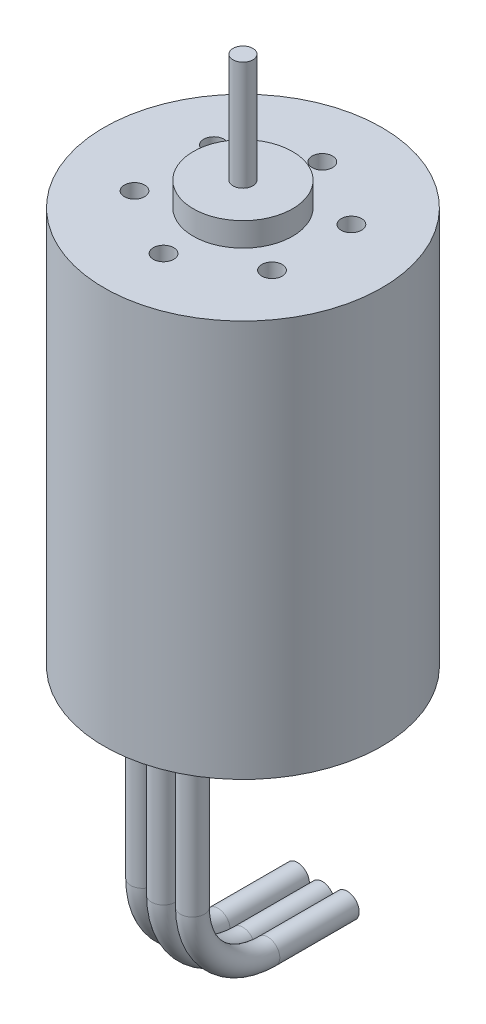
ISO-10303-21;
HEADER;
FILE_DESCRIPTION(('STEP AP214'),'2;1');
FILE_NAME('part.step','',(''),(''),'','','');
FILE_SCHEMA(('AUTOMOTIVE_DESIGN { 1 0 10303 214 1 1 1 1 }'));
ENDSEC;
DATA;
#1=APPLICATION_CONTEXT('core data for automotive mechanical design processes');
#2=APPLICATION_PROTOCOL_DEFINITION('international standard','automotive_design',2000,#1);
#3=PRODUCT_CONTEXT('',#1,'mechanical');
#4=PRODUCT('Part','Part','',(#3));
#5=PRODUCT_RELATED_PRODUCT_CATEGORY('part','',(#4));
#6=PRODUCT_DEFINITION_FORMATION('','',#4);
#7=PRODUCT_DEFINITION_CONTEXT('part definition',#1,'design');
#8=PRODUCT_DEFINITION('design','',#6,#7);
#9=PRODUCT_DEFINITION_SHAPE('','',#8);
#10=(LENGTH_UNIT() NAMED_UNIT(*) SI_UNIT(.MILLI.,.METRE.));
#11=(NAMED_UNIT(*) PLANE_ANGLE_UNIT() SI_UNIT($,.RADIAN.));
#12=(NAMED_UNIT(*) SI_UNIT($,.STERADIAN.) SOLID_ANGLE_UNIT());
#13=UNCERTAINTY_MEASURE_WITH_UNIT(LENGTH_MEASURE(1.E-05),#10,'distance_accuracy_value','');
#14=(GEOMETRIC_REPRESENTATION_CONTEXT(3) GLOBAL_UNCERTAINTY_ASSIGNED_CONTEXT((#13)) GLOBAL_UNIT_ASSIGNED_CONTEXT((#10,
#11,#12)) REPRESENTATION_CONTEXT('',''));
#15=CARTESIAN_POINT('',(0.,0.,0.));
#16=DIRECTION('',(0.,0.,1.));
#17=DIRECTION('',(1.,0.,0.));
#18=AXIS2_PLACEMENT_3D('',#15,#16,#17);
#19=CARTESIAN_POINT('',(0.,55.8,0.));
#20=DIRECTION('',(0.,1.,0.));
#21=DIRECTION('',(0.,0.,1.));
#22=AXIS2_PLACEMENT_3D('',#19,#20,#21);
#23=PLANE('',#22);
#24=CARTESIAN_POINT('',(0.,55.8,0.));
#25=DIRECTION('',(0.,-1.,0.));
#26=DIRECTION('',(0.,0.,-1.));
#27=AXIS2_PLACEMENT_3D('',#24,#25,#26);
#28=CIRCLE('',#27,1.);
#29=CARTESIAN_POINT('',(0.,55.8,-1.));
#30=VERTEX_POINT('',#29);
#31=EDGE_CURVE('E40',#30,#30,#28,.T.);
#32=ORIENTED_EDGE('',*,*,#31,.F.);
#33=EDGE_LOOP('',(#32));
#34=FACE_BOUND('',#33,.T.);
#35=ADVANCED_FACE('F37',(#34),#23,.T.);
#36=CARTESIAN_POINT('',(0.,0.,0.));
#37=DIRECTION('',(0.,-1.,0.));
#38=DIRECTION('',(0.,0.,-1.));
#39=AXIS2_PLACEMENT_3D('',#36,#37,#38);
#40=CYLINDRICAL_SURFACE('',#39,1.);
#41=ORIENTED_EDGE('',*,*,#31,.T.);
#42=EDGE_LOOP('',(#41));
#43=FACE_BOUND('',#42,.T.);
#44=CARTESIAN_POINT('',(0.,44.8,0.));
#45=DIRECTION('',(0.,-1.,0.));
#46=DIRECTION('',(0.,0.,-1.));
#47=AXIS2_PLACEMENT_3D('',#44,#45,#46);
#48=CIRCLE('',#47,1.);
#49=CARTESIAN_POINT('',(0.,44.8,-1.));
#50=VERTEX_POINT('',#49);
#51=EDGE_CURVE('E129',#50,#50,#48,.T.);
#52=ORIENTED_EDGE('',*,*,#51,.F.);
#53=EDGE_LOOP('',(#52));
#54=FACE_BOUND('',#53,.T.);
#55=ADVANCED_FACE('F168',(#43,#54),#40,.T.);
#56=CARTESIAN_POINT('',(1.,44.8,0.));
#57=DIRECTION('',(0.,1.,0.));
#58=DIRECTION('',(0.,0.,1.));
#59=AXIS2_PLACEMENT_3D('',#56,#57,#58);
#60=PLANE('',#59);
#61=ORIENTED_EDGE('',*,*,#51,.T.);
#62=EDGE_LOOP('',(#61));
#63=FACE_BOUND('',#62,.T.);
#64=CARTESIAN_POINT('',(0.,44.8,0.));
#65=DIRECTION('',(0.,-1.,0.));
#66=DIRECTION('',(0.,0.,-1.));
#67=AXIS2_PLACEMENT_3D('',#64,#65,#66);
#68=CIRCLE('',#67,4.99999999999999);
#69=CARTESIAN_POINT('',(0.,44.8,-4.99999999999999));
#70=VERTEX_POINT('',#69);
#71=EDGE_CURVE('E127',#70,#70,#68,.T.);
#72=ORIENTED_EDGE('',*,*,#71,.F.);
#73=EDGE_LOOP('',(#72));
#74=FACE_BOUND('',#73,.T.);
#75=ADVANCED_FACE('F173',(#63,#74),#60,.T.);
#76=CARTESIAN_POINT('',(0.,0.,0.));
#77=DIRECTION('',(0.,-1.,0.));
#78=DIRECTION('',(0.,0.,-1.));
#79=AXIS2_PLACEMENT_3D('',#76,#77,#78);
#80=CYLINDRICAL_SURFACE('',#79,4.99999999999999);
#81=ORIENTED_EDGE('',*,*,#71,.T.);
#82=EDGE_LOOP('',(#81));
#83=FACE_BOUND('',#82,.T.);
#84=CARTESIAN_POINT('',(0.,42.4,0.));
#85=DIRECTION('',(0.,-1.,0.));
#86=DIRECTION('',(0.,0.,-1.));
#87=AXIS2_PLACEMENT_3D('',#84,#85,#86);
#88=CIRCLE('',#87,4.99999999999999);
#89=CARTESIAN_POINT('',(0.,42.4,-4.99999999999999));
#90=VERTEX_POINT('',#89);
#91=EDGE_CURVE('E124',#90,#90,#88,.T.);
#92=ORIENTED_EDGE('',*,*,#91,.F.);
#93=EDGE_LOOP('',(#92));
#94=FACE_BOUND('',#93,.T.);
#95=ADVANCED_FACE('F177',(#83,#94),#80,.T.);
#96=CARTESIAN_POINT('',(4.99999999999999,42.4,0.));
#97=DIRECTION('',(0.,1.,0.));
#98=DIRECTION('',(0.,0.,1.));
#99=AXIS2_PLACEMENT_3D('',#96,#97,#98);
#100=PLANE('',#99);
#101=CARTESIAN_POINT('',(-6.92820323027546,42.4,-4.00000000000008));
#102=DIRECTION('',(0.,1.,0.));
#103=DIRECTION('',(0.,0.,1.));
#104=AXIS2_PLACEMENT_3D('',#101,#102,#103);
#105=CIRCLE('',#104,1.025);
#106=CARTESIAN_POINT('',(-6.92820323027546,42.4,-2.97500000000008));
#107=VERTEX_POINT('',#106);
#108=EDGE_CURVE('E76',#107,#107,#105,.T.);
#109=ORIENTED_EDGE('',*,*,#108,.F.);
#110=EDGE_LOOP('',(#109));
#111=FACE_BOUND('',#110,.T.);
#112=CARTESIAN_POINT('',(-6.92820323027555,42.4,3.99999999999994));
#113=DIRECTION('',(0.,1.,0.));
#114=DIRECTION('',(0.,0.,1.));
#115=AXIS2_PLACEMENT_3D('',#112,#113,#114);
#116=CIRCLE('',#115,1.025);
#117=CARTESIAN_POINT('',(-6.92820323027555,42.4,5.02499999999994));
#118=VERTEX_POINT('',#117);
#119=EDGE_CURVE('E75',#118,#118,#116,.T.);
#120=ORIENTED_EDGE('',*,*,#119,.F.);
#121=EDGE_LOOP('',(#120));
#122=FACE_BOUND('',#121,.T.);
#123=CARTESIAN_POINT('',(0.,42.4,8.));
#124=DIRECTION('',(0.,1.,0.));
#125=DIRECTION('',(0.,0.,1.));
#126=AXIS2_PLACEMENT_3D('',#123,#124,#125);
#127=CIRCLE('',#126,1.025);
#128=CARTESIAN_POINT('',(0.,42.4,9.025));
#129=VERTEX_POINT('',#128);
#130=EDGE_CURVE('E88',#129,#129,#127,.T.);
#131=ORIENTED_EDGE('',*,*,#130,.F.);
#132=EDGE_LOOP('',(#131));
#133=FACE_BOUND('',#132,.T.);
#134=CARTESIAN_POINT('',(6.92820323027549,42.4,4.00000000000003));
#135=DIRECTION('',(0.,1.,0.));
#136=DIRECTION('',(0.,0.,1.));
#137=AXIS2_PLACEMENT_3D('',#134,#135,#136);
#138=CIRCLE('',#137,1.025);
#139=CARTESIAN_POINT('',(6.92820323027549,42.4,5.02500000000003));
#140=VERTEX_POINT('',#139);
#141=EDGE_CURVE('E94',#140,#140,#138,.T.);
#142=ORIENTED_EDGE('',*,*,#141,.F.);
#143=EDGE_LOOP('',(#142));
#144=FACE_BOUND('',#143,.T.);
#145=CARTESIAN_POINT('',(6.92820323027552,42.4,-3.99999999999998));
#146=DIRECTION('',(0.,1.,0.));
#147=DIRECTION('',(0.,0.,1.));
#148=AXIS2_PLACEMENT_3D('',#145,#146,#147);
#149=CIRCLE('',#148,1.025);
#150=CARTESIAN_POINT('',(6.92820323027552,42.4,-2.97499999999999));
#151=VERTEX_POINT('',#150);
#152=EDGE_CURVE('E100',#151,#151,#149,.T.);
#153=ORIENTED_EDGE('',*,*,#152,.F.);
#154=EDGE_LOOP('',(#153));
#155=FACE_BOUND('',#154,.T.);
#156=CARTESIAN_POINT('',(0.,42.4,-8.));
#157=DIRECTION('',(0.,1.,0.));
#158=DIRECTION('',(0.,0.,1.));
#159=AXIS2_PLACEMENT_3D('',#156,#157,#158);
#160=CIRCLE('',#159,1.025);
#161=CARTESIAN_POINT('',(0.,42.4,-6.975));
#162=VERTEX_POINT('',#161);
#163=EDGE_CURVE('E106',#162,#162,#160,.T.);
#164=ORIENTED_EDGE('',*,*,#163,.F.);
#165=EDGE_LOOP('',(#164));
#166=FACE_BOUND('',#165,.T.);
#167=ORIENTED_EDGE('',*,*,#91,.T.);
#168=EDGE_LOOP('',(#167));
#169=FACE_BOUND('',#168,.T.);
#170=CARTESIAN_POINT('',(0.,42.4,0.));
#171=DIRECTION('',(0.,-1.,0.));
#172=DIRECTION('',(0.,0.,-1.));
#173=AXIS2_PLACEMENT_3D('',#170,#171,#172);
#174=CIRCLE('',#173,14.);
#175=CARTESIAN_POINT('',(0.,42.4,-14.));
#176=VERTEX_POINT('',#175);
#177=EDGE_CURVE('E121',#176,#176,#174,.T.);
#178=ORIENTED_EDGE('',*,*,#177,.F.);
#179=EDGE_LOOP('',(#178));
#180=FACE_BOUND('',#179,.T.);
#181=ADVANCED_FACE('F183',(#111,#122,#133,#144,#155,#166,#169,#180),#100,.T.);
#182=CARTESIAN_POINT('',(0.,0.,0.));
#183=DIRECTION('',(0.,-1.,0.));
#184=DIRECTION('',(0.,0.,-1.));
#185=AXIS2_PLACEMENT_3D('',#182,#183,#184);
#186=CYLINDRICAL_SURFACE('',#185,14.);
#187=ORIENTED_EDGE('',*,*,#177,.T.);
#188=EDGE_LOOP('',(#187));
#189=FACE_BOUND('',#188,.T.);
#190=CARTESIAN_POINT('',(0.,2.4,0.));
#191=DIRECTION('',(0.,-1.,0.));
#192=DIRECTION('',(0.,0.,-1.));
#193=AXIS2_PLACEMENT_3D('',#190,#191,#192);
#194=CIRCLE('',#193,14.);
#195=CARTESIAN_POINT('',(0.,2.4,-14.));
#196=VERTEX_POINT('',#195);
#197=EDGE_CURVE('E118',#196,#196,#194,.T.);
#198=ORIENTED_EDGE('',*,*,#197,.F.);
#199=EDGE_LOOP('',(#198));
#200=FACE_BOUND('',#199,.T.);
#201=ADVANCED_FACE('F187',(#189,#200),#186,.T.);
#202=CARTESIAN_POINT('',(5.,2.4,0.));
#203=DIRECTION('',(0.,-1.,0.));
#204=DIRECTION('',(0.,0.,-1.));
#205=AXIS2_PLACEMENT_3D('',#202,#203,#204);
#206=PLANE('',#205);
#207=CARTESIAN_POINT('',(-2.50778978372889,2.4,7.596775));
#208=DIRECTION('',(0.,-1.,0.));
#209=DIRECTION('',(0.,0.,-1.));
#210=AXIS2_PLACEMENT_3D('',#207,#208,#209);
#211=CIRCLE('',#210,1.2065);
#212=CARTESIAN_POINT('',(-2.50778978372889,2.4,6.390275));
#213=VERTEX_POINT('',#212);
#214=EDGE_CURVE('E11',#213,#213,#211,.T.);
#215=ORIENTED_EDGE('',*,*,#214,.F.);
#216=EDGE_LOOP('',(#215));
#217=FACE_BOUND('',#216,.T.);
#218=CARTESIAN_POINT('',(0.,2.4,8.));
#219=DIRECTION('',(0.,-1.,0.));
#220=DIRECTION('',(0.,0.,-1.));
#221=AXIS2_PLACEMENT_3D('',#218,#219,#220);
#222=CIRCLE('',#221,1.2065);
#223=CARTESIAN_POINT('',(0.,2.4,6.7935));
#224=VERTEX_POINT('',#223);
#225=EDGE_CURVE('E45',#224,#224,#222,.T.);
#226=ORIENTED_EDGE('',*,*,#225,.F.);
#227=EDGE_LOOP('',(#226));
#228=FACE_BOUND('',#227,.T.);
#229=CARTESIAN_POINT('',(2.50778978372889,2.4,7.596775));
#230=DIRECTION('',(0.,-1.,0.));
#231=DIRECTION('',(0.,0.,-1.));
#232=AXIS2_PLACEMENT_3D('',#229,#230,#231);
#233=CIRCLE('',#232,1.2065);
#234=CARTESIAN_POINT('',(2.50778978372889,2.4,6.390275));
#235=VERTEX_POINT('',#234);
#236=EDGE_CURVE('E134',#235,#235,#233,.T.);
#237=ORIENTED_EDGE('',*,*,#236,.F.);
#238=EDGE_LOOP('',(#237));
#239=FACE_BOUND('',#238,.T.);
#240=ORIENTED_EDGE('',*,*,#197,.T.);
#241=EDGE_LOOP('',(#240));
#242=FACE_BOUND('',#241,.T.);
#243=CARTESIAN_POINT('',(0.,2.4,0.));
#244=DIRECTION('',(0.,-1.,0.));
#245=DIRECTION('',(0.,0.,-1.));
#246=AXIS2_PLACEMENT_3D('',#243,#244,#245);
#247=CIRCLE('',#246,5.);
#248=CARTESIAN_POINT('',(0.,2.4,-5.));
#249=VERTEX_POINT('',#248);
#250=EDGE_CURVE('E115',#249,#249,#247,.T.);
#251=ORIENTED_EDGE('',*,*,#250,.F.);
#252=EDGE_LOOP('',(#251));
#253=FACE_BOUND('',#252,.T.);
#254=ADVANCED_FACE('F191',(#217,#228,#239,#242,#253),#206,.T.);
#255=CARTESIAN_POINT('',(0.,0.,0.));
#256=DIRECTION('',(0.,-1.,0.));
#257=DIRECTION('',(0.,0.,-1.));
#258=AXIS2_PLACEMENT_3D('',#255,#256,#257);
#259=CYLINDRICAL_SURFACE('',#258,5.);
#260=ORIENTED_EDGE('',*,*,#250,.T.);
#261=EDGE_LOOP('',(#260));
#262=FACE_BOUND('',#261,.T.);
#263=CARTESIAN_POINT('',(0.,0.,0.));
#264=DIRECTION('',(0.,-1.,0.));
#265=DIRECTION('',(0.,0.,-1.));
#266=AXIS2_PLACEMENT_3D('',#263,#264,#265);
#267=CIRCLE('',#266,5.);
#268=CARTESIAN_POINT('',(0.,0.,-5.));
#269=VERTEX_POINT('',#268);
#270=EDGE_CURVE('E112',#269,#269,#267,.T.);
#271=ORIENTED_EDGE('',*,*,#270,.F.);
#272=EDGE_LOOP('',(#271));
#273=FACE_BOUND('',#272,.T.);
#274=ADVANCED_FACE('F195',(#262,#273),#259,.T.);
#275=CARTESIAN_POINT('',(0.,0.,0.));
#276=DIRECTION('',(0.,-1.,0.));
#277=DIRECTION('',(0.,0.,-1.));
#278=AXIS2_PLACEMENT_3D('',#275,#276,#277);
#279=PLANE('',#278);
#280=ORIENTED_EDGE('',*,*,#270,.T.);
#281=EDGE_LOOP('',(#280));
#282=FACE_BOUND('',#281,.T.);
#283=ADVANCED_FACE('F199',(#282),#279,.T.);
#284=CARTESIAN_POINT('',(0.,38.400008,-8.));
#285=DIRECTION('',(0.,1.,0.));
#286=DIRECTION('',(0.,0.,1.));
#287=AXIS2_PLACEMENT_3D('',#284,#285,#286);
#288=CONICAL_SURFACE('',#287,1.025,1.02974425867665);
#289=CARTESIAN_POINT('',(0.,37.7841258654968,-8.));
#290=VERTEX_POINT('',#289);
#291=VERTEX_LOOP('',#290);
#292=FACE_BOUND('',#291,.T.);
#293=CARTESIAN_POINT('',(0.,38.400008,-8.));
#294=DIRECTION('',(0.,1.,0.));
#295=DIRECTION('',(0.,0.,1.));
#296=AXIS2_PLACEMENT_3D('',#293,#294,#295);
#297=CIRCLE('',#296,1.025);
#298=CARTESIAN_POINT('',(0.,38.400008,-6.975));
#299=VERTEX_POINT('',#298);
#300=EDGE_CURVE('E109',#299,#299,#297,.T.);
#301=ORIENTED_EDGE('',*,*,#300,.T.);
#302=EDGE_LOOP('',(#301));
#303=FACE_BOUND('',#302,.T.);
#304=ADVANCED_FACE('F203',(#292,#303),#288,.F.);
#305=CARTESIAN_POINT('',(0.,42.4,-8.));
#306=DIRECTION('',(0.,1.,0.));
#307=DIRECTION('',(0.,0.,1.));
#308=AXIS2_PLACEMENT_3D('',#305,#306,#307);
#309=CYLINDRICAL_SURFACE('',#308,1.025);
#310=ORIENTED_EDGE('',*,*,#300,.F.);
#311=EDGE_LOOP('',(#310));
#312=FACE_BOUND('',#311,.T.);
#313=ORIENTED_EDGE('',*,*,#163,.T.);
#314=EDGE_LOOP('',(#313));
#315=FACE_BOUND('',#314,.T.);
#316=ADVANCED_FACE('F207',(#312,#315),#309,.F.);
#317=CARTESIAN_POINT('',(6.92820323027552,38.400008,-3.99999999999998));
#318=DIRECTION('',(0.,1.,0.));
#319=DIRECTION('',(0.,0.,1.));
#320=AXIS2_PLACEMENT_3D('',#317,#318,#319);
#321=CONICAL_SURFACE('',#320,1.025,1.02974425867666);
#322=CARTESIAN_POINT('',(6.92820323027552,37.7841258654968,-3.99999999999998));
#323=VERTEX_POINT('',#322);
#324=VERTEX_LOOP('',#323);
#325=FACE_BOUND('',#324,.T.);
#326=CARTESIAN_POINT('',(6.92820323027552,38.400008,-3.99999999999998));
#327=DIRECTION('',(0.,1.,0.));
#328=DIRECTION('',(0.,0.,1.));
#329=AXIS2_PLACEMENT_3D('',#326,#327,#328);
#330=CIRCLE('',#329,1.025);
#331=CARTESIAN_POINT('',(6.92820323027552,38.400008,-2.97499999999999));
#332=VERTEX_POINT('',#331);
#333=EDGE_CURVE('E103',#332,#332,#330,.T.);
#334=ORIENTED_EDGE('',*,*,#333,.T.);
#335=EDGE_LOOP('',(#334));
#336=FACE_BOUND('',#335,.T.);
#337=ADVANCED_FACE('F210',(#325,#336),#321,.F.);
#338=CARTESIAN_POINT('',(6.92820323027552,42.4,-3.99999999999998));
#339=DIRECTION('',(0.,1.,0.));
#340=DIRECTION('',(0.,0.,1.));
#341=AXIS2_PLACEMENT_3D('',#338,#339,#340);
#342=CYLINDRICAL_SURFACE('',#341,1.025);
#343=ORIENTED_EDGE('',*,*,#333,.F.);
#344=EDGE_LOOP('',(#343));
#345=FACE_BOUND('',#344,.T.);
#346=ORIENTED_EDGE('',*,*,#152,.T.);
#347=EDGE_LOOP('',(#346));
#348=FACE_BOUND('',#347,.T.);
#349=ADVANCED_FACE('F214',(#345,#348),#342,.F.);
#350=CARTESIAN_POINT('',(6.92820323027549,38.400008,4.00000000000003));
#351=DIRECTION('',(0.,1.,0.));
#352=DIRECTION('',(0.,0.,1.));
#353=AXIS2_PLACEMENT_3D('',#350,#351,#352);
#354=CONICAL_SURFACE('',#353,1.025,1.02974425867665);
#355=CARTESIAN_POINT('',(6.92820323027549,37.7841258654968,4.00000000000003));
#356=VERTEX_POINT('',#355);
#357=VERTEX_LOOP('',#356);
#358=FACE_BOUND('',#357,.T.);
#359=CARTESIAN_POINT('',(6.92820323027549,38.400008,4.00000000000003));
#360=DIRECTION('',(0.,1.,0.));
#361=DIRECTION('',(0.,0.,1.));
#362=AXIS2_PLACEMENT_3D('',#359,#360,#361);
#363=CIRCLE('',#362,1.025);
#364=CARTESIAN_POINT('',(6.92820323027549,38.400008,5.02500000000003));
#365=VERTEX_POINT('',#364);
#366=EDGE_CURVE('E97',#365,#365,#363,.T.);
#367=ORIENTED_EDGE('',*,*,#366,.T.);
#368=EDGE_LOOP('',(#367));
#369=FACE_BOUND('',#368,.T.);
#370=ADVANCED_FACE('F217',(#358,#369),#354,.F.);
#371=CARTESIAN_POINT('',(6.92820323027549,42.4,4.00000000000003));
#372=DIRECTION('',(0.,1.,0.));
#373=DIRECTION('',(0.,0.,1.));
#374=AXIS2_PLACEMENT_3D('',#371,#372,#373);
#375=CYLINDRICAL_SURFACE('',#374,1.025);
#376=ORIENTED_EDGE('',*,*,#366,.F.);
#377=EDGE_LOOP('',(#376));
#378=FACE_BOUND('',#377,.T.);
#379=ORIENTED_EDGE('',*,*,#141,.T.);
#380=EDGE_LOOP('',(#379));
#381=FACE_BOUND('',#380,.T.);
#382=ADVANCED_FACE('F221',(#378,#381),#375,.F.);
#383=CARTESIAN_POINT('',(0.,38.400008,8.));
#384=DIRECTION('',(0.,1.,0.));
#385=DIRECTION('',(0.,0.,1.));
#386=AXIS2_PLACEMENT_3D('',#383,#384,#385);
#387=CONICAL_SURFACE('',#386,1.025,1.02974425867665);
#388=CARTESIAN_POINT('',(0.,37.7841258654968,8.));
#389=VERTEX_POINT('',#388);
#390=VERTEX_LOOP('',#389);
#391=FACE_BOUND('',#390,.T.);
#392=CARTESIAN_POINT('',(0.,38.400008,8.));
#393=DIRECTION('',(0.,1.,0.));
#394=DIRECTION('',(0.,0.,1.));
#395=AXIS2_PLACEMENT_3D('',#392,#393,#394);
#396=CIRCLE('',#395,1.025);
#397=CARTESIAN_POINT('',(0.,38.400008,9.025));
#398=VERTEX_POINT('',#397);
#399=EDGE_CURVE('E91',#398,#398,#396,.T.);
#400=ORIENTED_EDGE('',*,*,#399,.T.);
#401=EDGE_LOOP('',(#400));
#402=FACE_BOUND('',#401,.T.);
#403=ADVANCED_FACE('F225',(#391,#402),#387,.F.);
#404=CARTESIAN_POINT('',(0.,42.4,8.));
#405=DIRECTION('',(0.,1.,0.));
#406=DIRECTION('',(0.,0.,1.));
#407=AXIS2_PLACEMENT_3D('',#404,#405,#406);
#408=CYLINDRICAL_SURFACE('',#407,1.025);
#409=ORIENTED_EDGE('',*,*,#399,.F.);
#410=EDGE_LOOP('',(#409));
#411=FACE_BOUND('',#410,.T.);
#412=ORIENTED_EDGE('',*,*,#130,.T.);
#413=EDGE_LOOP('',(#412));
#414=FACE_BOUND('',#413,.T.);
#415=ADVANCED_FACE('F229',(#411,#414),#408,.F.);
#416=CARTESIAN_POINT('',(-6.92820323027555,38.400008,3.99999999999994));
#417=DIRECTION('',(0.,1.,0.));
#418=DIRECTION('',(0.,0.,1.));
#419=AXIS2_PLACEMENT_3D('',#416,#417,#418);
#420=CONICAL_SURFACE('',#419,1.025,1.02974425867665);
#421=CARTESIAN_POINT('',(-6.92820323027555,37.7841258654968,3.99999999999994));
#422=VERTEX_POINT('',#421);
#423=VERTEX_LOOP('',#422);
#424=FACE_BOUND('',#423,.T.);
#425=CARTESIAN_POINT('',(-6.92820323027555,38.400008,3.99999999999994));
#426=DIRECTION('',(0.,1.,0.));
#427=DIRECTION('',(0.,0.,1.));
#428=AXIS2_PLACEMENT_3D('',#425,#426,#427);
#429=CIRCLE('',#428,1.025);
#430=CARTESIAN_POINT('',(-6.92820323027555,38.400008,5.02499999999993));
#431=VERTEX_POINT('',#430);
#432=EDGE_CURVE('E79',#431,#431,#429,.T.);
#433=ORIENTED_EDGE('',*,*,#432,.T.);
#434=EDGE_LOOP('',(#433));
#435=FACE_BOUND('',#434,.T.);
#436=ADVANCED_FACE('F233',(#424,#435),#420,.F.);
#437=CARTESIAN_POINT('',(-6.92820323027555,42.4,3.99999999999994));
#438=DIRECTION('',(0.,1.,0.));
#439=DIRECTION('',(0.,0.,1.));
#440=AXIS2_PLACEMENT_3D('',#437,#438,#439);
#441=CYLINDRICAL_SURFACE('',#440,1.025);
#442=ORIENTED_EDGE('',*,*,#432,.F.);
#443=EDGE_LOOP('',(#442));
#444=FACE_BOUND('',#443,.T.);
#445=ORIENTED_EDGE('',*,*,#119,.T.);
#446=EDGE_LOOP('',(#445));
#447=FACE_BOUND('',#446,.T.);
#448=ADVANCED_FACE('F69',(#444,#447),#441,.F.);
#449=CARTESIAN_POINT('',(-6.92820323027546,38.400008,-4.00000000000008));
#450=DIRECTION('',(0.,1.,0.));
#451=DIRECTION('',(0.,0.,1.));
#452=AXIS2_PLACEMENT_3D('',#449,#450,#451);
#453=CONICAL_SURFACE('',#452,1.025,1.02974425867665);
#454=CARTESIAN_POINT('',(-6.92820323027546,37.7841258654968,-4.00000000000008));
#455=VERTEX_POINT('',#454);
#456=VERTEX_LOOP('',#455);
#457=FACE_BOUND('',#456,.T.);
#458=CARTESIAN_POINT('',(-6.92820323027546,38.400008,-4.00000000000008));
#459=DIRECTION('',(0.,1.,0.));
#460=DIRECTION('',(0.,0.,1.));
#461=AXIS2_PLACEMENT_3D('',#458,#459,#460);
#462=CIRCLE('',#461,1.025);
#463=CARTESIAN_POINT('',(-6.92820323027546,38.400008,-2.97500000000008));
#464=VERTEX_POINT('',#463);
#465=EDGE_CURVE('E73',#464,#464,#462,.T.);
#466=ORIENTED_EDGE('',*,*,#465,.T.);
#467=EDGE_LOOP('',(#466));
#468=FACE_BOUND('',#467,.T.);
#469=ADVANCED_FACE('F65',(#457,#468),#453,.F.);
#470=CARTESIAN_POINT('',(-6.92820323027546,42.4,-4.00000000000008));
#471=DIRECTION('',(0.,1.,0.));
#472=DIRECTION('',(0.,0.,1.));
#473=AXIS2_PLACEMENT_3D('',#470,#471,#472);
#474=CYLINDRICAL_SURFACE('',#473,1.025);
#475=ORIENTED_EDGE('',*,*,#465,.F.);
#476=EDGE_LOOP('',(#475));
#477=FACE_BOUND('',#476,.T.);
#478=ORIENTED_EDGE('',*,*,#108,.T.);
#479=EDGE_LOOP('',(#478));
#480=FACE_BOUND('',#479,.T.);
#481=ADVANCED_FACE('F68',(#477,#480),#474,.F.);
#482=CARTESIAN_POINT('',(2.50778978372889,-21.196775,0.));
#483=DIRECTION('',(0.,0.,-1.));
#484=DIRECTION('',(-1.,0.,0.));
#485=AXIS2_PLACEMENT_3D('',#482,#483,#484);
#486=CYLINDRICAL_SURFACE('',#485,1.2065);
#487=CARTESIAN_POINT('',(2.50778978372889,-21.196775,0.));
#488=DIRECTION('',(0.,0.,-1.));
#489=DIRECTION('',(0.,1.,0.));
#490=AXIS2_PLACEMENT_3D('',#487,#488,#489);
#491=CIRCLE('',#490,1.2065);
#492=CARTESIAN_POINT('',(2.50778978372889,-22.403275,0.));
#493=VERTEX_POINT('',#492);
#494=EDGE_CURVE('E147',#493,#493,#491,.T.);
#495=ORIENTED_EDGE('',*,*,#494,.T.);
#496=EDGE_LOOP('',(#495));
#497=FACE_BOUND('',#496,.T.);
#498=CARTESIAN_POINT('',(2.50778978372889,-21.196775,-8.00000000000001));
#499=DIRECTION('',(0.,0.,-1.));
#500=DIRECTION('',(0.,1.,0.));
#501=AXIS2_PLACEMENT_3D('',#498,#499,#500);
#502=CIRCLE('',#501,1.2065);
#503=CARTESIAN_POINT('',(2.50778978372889,-19.990275,-8.00000000000001));
#504=VERTEX_POINT('',#503);
#505=EDGE_CURVE('E82',#504,#504,#502,.T.);
#506=ORIENTED_EDGE('',*,*,#505,.F.);
#507=EDGE_LOOP('',(#506));
#508=FACE_BOUND('',#507,.T.);
#509=ADVANCED_FACE('F154',(#497,#508),#486,.T.);
#510=CARTESIAN_POINT('',(2.50778978372889,-13.6,0.));
#511=DIRECTION('',(1.,0.,0.));
#512=DIRECTION('',(0.,0.,-1.));
#513=AXIS2_PLACEMENT_3D('',#510,#511,#512);
#514=TOROIDAL_SURFACE('',#513,7.596775,1.2065);
#515=CARTESIAN_POINT('',(2.50778978372889,-13.6,7.596775));
#516=DIRECTION('',(0.,-1.,0.));
#517=DIRECTION('',(0.,0.,-1.));
#518=AXIS2_PLACEMENT_3D('',#515,#516,#517);
#519=CIRCLE('',#518,1.2065);
#520=CARTESIAN_POINT('',(2.50778978372889,-13.6,8.803275));
#521=VERTEX_POINT('',#520);
#522=EDGE_CURVE('E145',#521,#521,#519,.T.);
#523=CARTESIAN_POINT('',(2.50778978372889,-13.6,0.));
#524=DIRECTION('',(1.,0.,0.));
#525=DIRECTION('',(0.,0.,-1.));
#526=AXIS2_PLACEMENT_3D('',#523,#524,#525);
#527=CIRCLE('',#526,8.803275);
#528=EDGE_CURVE('',#521,#493,#527,.T.);
#529=ORIENTED_EDGE('',*,*,#522,.T.);
#530=ORIENTED_EDGE('',*,*,#494,.F.);
#531=ORIENTED_EDGE('',*,*,#528,.T.);
#532=ORIENTED_EDGE('',*,*,#528,.F.);
#533=EDGE_LOOP('',(#529,#531,#530,#532));
#534=FACE_BOUND('',#533,.T.);
#535=ADVANCED_FACE('F156',(#534),#514,.T.);
#536=CARTESIAN_POINT('',(2.50778978372889,-13.6,7.596775));
#537=DIRECTION('',(0.,1.,0.));
#538=DIRECTION('',(0.,0.,1.));
#539=AXIS2_PLACEMENT_3D('',#536,#537,#538);
#540=CYLINDRICAL_SURFACE('',#539,1.2065);
#541=ORIENTED_EDGE('',*,*,#522,.F.);
#542=EDGE_LOOP('',(#541));
#543=FACE_BOUND('',#542,.T.);
#544=ORIENTED_EDGE('',*,*,#236,.T.);
#545=EDGE_LOOP('',(#544));
#546=FACE_BOUND('',#545,.T.);
#547=ADVANCED_FACE('F163',(#543,#546),#540,.T.);
#548=CARTESIAN_POINT('',(2.50778978372889,-21.196775,-8.00000000000001));
#549=DIRECTION('',(0.,0.,-1.));
#550=DIRECTION('',(0.,1.,0.));
#551=AXIS2_PLACEMENT_3D('',#548,#549,#550);
#552=PLANE('',#551);
#553=ORIENTED_EDGE('',*,*,#505,.T.);
#554=EDGE_LOOP('',(#553));
#555=FACE_BOUND('',#554,.T.);
#556=ADVANCED_FACE('F152',(#555),#552,.T.);
#557=CARTESIAN_POINT('',(0.,-21.6,0.));
#558=DIRECTION('',(0.,0.,-1.));
#559=DIRECTION('',(-1.,0.,0.));
#560=AXIS2_PLACEMENT_3D('',#557,#558,#559);
#561=CYLINDRICAL_SURFACE('',#560,1.2065);
#562=CARTESIAN_POINT('',(0.,-21.6,0.));
#563=DIRECTION('',(0.,0.,-1.));
#564=DIRECTION('',(0.,1.,0.));
#565=AXIS2_PLACEMENT_3D('',#562,#563,#564);
#566=CIRCLE('',#565,1.2065);
#567=CARTESIAN_POINT('',(0.,-22.8065,0.));
#568=VERTEX_POINT('',#567);
#569=EDGE_CURVE('E558',#568,#568,#566,.T.);
#570=ORIENTED_EDGE('',*,*,#569,.T.);
#571=EDGE_LOOP('',(#570));
#572=FACE_BOUND('',#571,.T.);
#573=CARTESIAN_POINT('',(0.,-21.6,-8.00000000000001));
#574=DIRECTION('',(0.,0.,-1.));
#575=DIRECTION('',(0.,1.,0.));
#576=AXIS2_PLACEMENT_3D('',#573,#574,#575);
#577=CIRCLE('',#576,1.2065);
#578=CARTESIAN_POINT('',(0.,-20.3935,-8.00000000000001));
#579=VERTEX_POINT('',#578);
#580=EDGE_CURVE('E565',#579,#579,#577,.T.);
#581=ORIENTED_EDGE('',*,*,#580,.F.);
#582=EDGE_LOOP('',(#581));
#583=FACE_BOUND('',#582,.T.);
#584=ADVANCED_FACE('F354',(#572,#583),#561,.T.);
#585=CARTESIAN_POINT('',(0.,-13.6,0.));
#586=DIRECTION('',(1.,0.,0.));
#587=DIRECTION('',(0.,0.,-1.));
#588=AXIS2_PLACEMENT_3D('',#585,#586,#587);
#589=TOROIDAL_SURFACE('',#588,8.,1.2065);
#590=CARTESIAN_POINT('',(0.,-13.6,8.));
#591=DIRECTION('',(0.,-1.,0.));
#592=DIRECTION('',(0.,0.,-1.));
#593=AXIS2_PLACEMENT_3D('',#590,#591,#592);
#594=CIRCLE('',#593,1.2065);
#595=CARTESIAN_POINT('',(0.,-13.6,9.2065));
#596=VERTEX_POINT('',#595);
#597=EDGE_CURVE('E554',#596,#596,#594,.T.);
#598=CARTESIAN_POINT('',(0.,-13.6,0.));
#599=DIRECTION('',(1.,0.,0.));
#600=DIRECTION('',(0.,0.,-1.));
#601=AXIS2_PLACEMENT_3D('',#598,#599,#600);
#602=CIRCLE('',#601,9.2065);
#603=EDGE_CURVE('',#596,#568,#602,.T.);
#604=ORIENTED_EDGE('',*,*,#597,.T.);
#605=ORIENTED_EDGE('',*,*,#569,.F.);
#606=ORIENTED_EDGE('',*,*,#603,.T.);
#607=ORIENTED_EDGE('',*,*,#603,.F.);
#608=EDGE_LOOP('',(#604,#606,#605,#607));
#609=FACE_BOUND('',#608,.T.);
#610=ADVANCED_FACE('F363',(#609),#589,.T.);
#611=CARTESIAN_POINT('',(0.,-13.6,8.));
#612=DIRECTION('',(0.,1.,0.));
#613=DIRECTION('',(0.,0.,1.));
#614=AXIS2_PLACEMENT_3D('',#611,#612,#613);
#615=CYLINDRICAL_SURFACE('',#614,1.2065);
#616=ORIENTED_EDGE('',*,*,#597,.F.);
#617=EDGE_LOOP('',(#616));
#618=FACE_BOUND('',#617,.T.);
#619=ORIENTED_EDGE('',*,*,#225,.T.);
#620=EDGE_LOOP('',(#619));
#621=FACE_BOUND('',#620,.T.);
#622=ADVANCED_FACE('F373',(#618,#621),#615,.T.);
#623=CARTESIAN_POINT('',(0.,-21.6,-8.00000000000001));
#624=DIRECTION('',(0.,0.,-1.));
#625=DIRECTION('',(0.,1.,0.));
#626=AXIS2_PLACEMENT_3D('',#623,#624,#625);
#627=PLANE('',#626);
#628=ORIENTED_EDGE('',*,*,#580,.T.);
#629=EDGE_LOOP('',(#628));
#630=FACE_BOUND('',#629,.T.);
#631=ADVANCED_FACE('F383',(#630),#627,.T.);
#632=CARTESIAN_POINT('',(-2.50778978372889,-21.196775,0.));
#633=DIRECTION('',(0.,0.,-1.));
#634=DIRECTION('',(-1.,0.,0.));
#635=AXIS2_PLACEMENT_3D('',#632,#633,#634);
#636=CYLINDRICAL_SURFACE('',#635,1.2065);
#637=CARTESIAN_POINT('',(-2.50778978372889,-21.196775,0.));
#638=DIRECTION('',(0.,0.,-1.));
#639=DIRECTION('',(0.,1.,0.));
#640=AXIS2_PLACEMENT_3D('',#637,#638,#639);
#641=CIRCLE('',#640,1.2065);
#642=CARTESIAN_POINT('',(-2.50778978372889,-22.403275,0.));
#643=VERTEX_POINT('',#642);
#644=EDGE_CURVE('E555',#643,#643,#641,.T.);
#645=ORIENTED_EDGE('',*,*,#644,.T.);
#646=EDGE_LOOP('',(#645));
#647=FACE_BOUND('',#646,.T.);
#648=CARTESIAN_POINT('',(-2.50778978372889,-21.196775,-8.00000000000001));
#649=DIRECTION('',(0.,0.,-1.));
#650=DIRECTION('',(0.,1.,0.));
#651=AXIS2_PLACEMENT_3D('',#648,#649,#650);
#652=CIRCLE('',#651,1.2065);
#653=CARTESIAN_POINT('',(-2.50778978372889,-19.990275,-8.00000000000001));
#654=VERTEX_POINT('',#653);
#655=EDGE_CURVE('E552',#654,#654,#652,.T.);
#656=ORIENTED_EDGE('',*,*,#655,.F.);
#657=EDGE_LOOP('',(#656));
#658=FACE_BOUND('',#657,.T.);
#659=ADVANCED_FACE('F393',(#647,#658),#636,.T.);
#660=CARTESIAN_POINT('',(-2.50778978372889,-13.6,0.));
#661=DIRECTION('',(1.,0.,0.));
#662=DIRECTION('',(0.,0.,-1.));
#663=AXIS2_PLACEMENT_3D('',#660,#661,#662);
#664=TOROIDAL_SURFACE('',#663,7.596775,1.2065);
#665=CARTESIAN_POINT('',(-2.50778978372889,-13.6,7.596775));
#666=DIRECTION('',(0.,-1.,0.));
#667=DIRECTION('',(0.,0.,-1.));
#668=AXIS2_PLACEMENT_3D('',#665,#666,#667);
#669=CIRCLE('',#668,1.2065);
#670=CARTESIAN_POINT('',(-2.50778978372889,-13.6,8.803275));
#671=VERTEX_POINT('',#670);
#672=EDGE_CURVE('E561',#671,#671,#669,.T.);
#673=CARTESIAN_POINT('',(-2.50778978372889,-13.6,0.));
#674=DIRECTION('',(1.,0.,0.));
#675=DIRECTION('',(0.,0.,-1.));
#676=AXIS2_PLACEMENT_3D('',#673,#674,#675);
#677=CIRCLE('',#676,8.803275);
#678=EDGE_CURVE('',#671,#643,#677,.T.);
#679=ORIENTED_EDGE('',*,*,#672,.T.);
#680=ORIENTED_EDGE('',*,*,#644,.F.);
#681=ORIENTED_EDGE('',*,*,#678,.T.);
#682=ORIENTED_EDGE('',*,*,#678,.F.);
#683=EDGE_LOOP('',(#679,#681,#680,#682));
#684=FACE_BOUND('',#683,.T.);
#685=ADVANCED_FACE('F403',(#684),#664,.T.);
#686=CARTESIAN_POINT('',(-2.50778978372889,-13.6,7.596775));
#687=DIRECTION('',(0.,1.,0.));
#688=DIRECTION('',(0.,0.,1.));
#689=AXIS2_PLACEMENT_3D('',#686,#687,#688);
#690=CYLINDRICAL_SURFACE('',#689,1.2065);
#691=ORIENTED_EDGE('',*,*,#672,.F.);
#692=EDGE_LOOP('',(#691));
#693=FACE_BOUND('',#692,.T.);
#694=ORIENTED_EDGE('',*,*,#214,.T.);
#695=EDGE_LOOP('',(#694));
#696=FACE_BOUND('',#695,.T.);
#697=ADVANCED_FACE('F413',(#693,#696),#690,.T.);
#698=CARTESIAN_POINT('',(-2.50778978372889,-21.196775,-8.00000000000001));
#699=DIRECTION('',(0.,0.,-1.));
#700=DIRECTION('',(0.,1.,0.));
#701=AXIS2_PLACEMENT_3D('',#698,#699,#700);
#702=PLANE('',#701);
#703=ORIENTED_EDGE('',*,*,#655,.T.);
#704=EDGE_LOOP('',(#703));
#705=FACE_BOUND('',#704,.T.);
#706=ADVANCED_FACE('F423',(#705),#702,.T.);
#707=CLOSED_SHELL('',(#35,#55,#75,#95,#181,#201,#254,#274,#283,#304,#316,#337,#349,#370,#382,
#403,#415,#436,#448,#469,#481,#509,#535,#547,#556,#584,#610,#622,#631,#659,#685,#697,#706));
#708=MANIFOLD_SOLID_BREP('B2',#707);
#709=ADVANCED_BREP_SHAPE_REPRESENTATION('',(#18,#708),#14);
#710=SHAPE_DEFINITION_REPRESENTATION(#9,#709);
ENDSEC;
END-ISO-10303-21;
